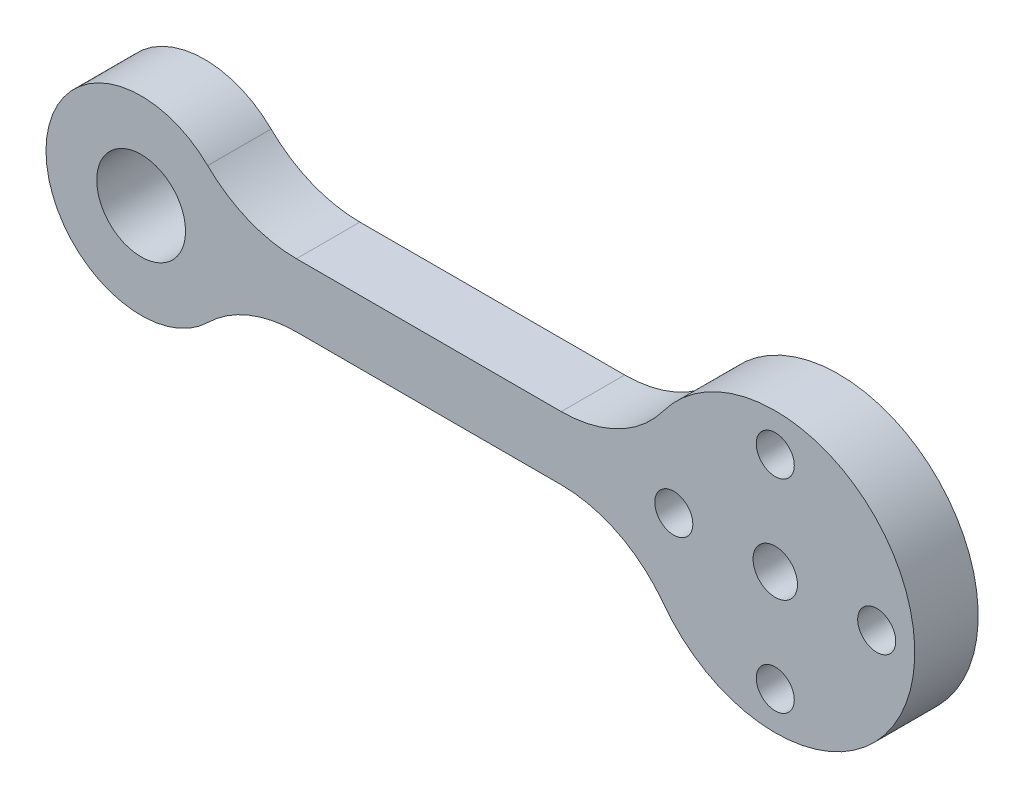
ISO-10303-21;
HEADER;
FILE_DESCRIPTION(('STEP AP214'),'2;1');
FILE_NAME('part.step','',(''),(''),'','','');
FILE_SCHEMA(('AUTOMOTIVE_DESIGN { 1 0 10303 214 1 1 1 1 }'));
ENDSEC;
DATA;
#1=APPLICATION_CONTEXT('core data for automotive mechanical design processes');
#2=APPLICATION_PROTOCOL_DEFINITION('international standard','automotive_design',2000,#1);
#3=PRODUCT_CONTEXT('',#1,'mechanical');
#4=PRODUCT('Part','Part','',(#3));
#5=PRODUCT_RELATED_PRODUCT_CATEGORY('part','',(#4));
#6=PRODUCT_DEFINITION_FORMATION('','',#4);
#7=PRODUCT_DEFINITION_CONTEXT('part definition',#1,'design');
#8=PRODUCT_DEFINITION('design','',#6,#7);
#9=PRODUCT_DEFINITION_SHAPE('','',#8);
#10=(LENGTH_UNIT() NAMED_UNIT(*) SI_UNIT(.MILLI.,.METRE.));
#11=(NAMED_UNIT(*) PLANE_ANGLE_UNIT() SI_UNIT($,.RADIAN.));
#12=(NAMED_UNIT(*) SI_UNIT($,.STERADIAN.) SOLID_ANGLE_UNIT());
#13=UNCERTAINTY_MEASURE_WITH_UNIT(LENGTH_MEASURE(1.E-05),#10,'distance_accuracy_value','');
#14=(GEOMETRIC_REPRESENTATION_CONTEXT(3) GLOBAL_UNCERTAINTY_ASSIGNED_CONTEXT((#13)) GLOBAL_UNIT_ASSIGNED_CONTEXT((#10,
#11,#12)) REPRESENTATION_CONTEXT('',''));
#15=CARTESIAN_POINT('',(0.,0.,0.));
#16=DIRECTION('',(0.,0.,1.));
#17=DIRECTION('',(1.,0.,0.));
#18=AXIS2_PLACEMENT_3D('',#15,#16,#17);
#19=CARTESIAN_POINT('',(0.,0.,-5.));
#20=DIRECTION('',(0.,0.,1.));
#21=DIRECTION('',(1.,0.,0.));
#22=AXIS2_PLACEMENT_3D('',#19,#20,#21);
#23=CYLINDRICAL_SURFACE('',#22,7.5);
#24=CARTESIAN_POINT('',(0.,0.,-5.));
#25=DIRECTION('',(0.,0.,1.));
#26=DIRECTION('',(1.,0.,0.));
#27=AXIS2_PLACEMENT_3D('',#24,#25,#26);
#28=CIRCLE('',#27,7.5);
#29=CARTESIAN_POINT('',(5.24890659167824,5.35714285714286,-5.));
#30=VERTEX_POINT('',#29);
#31=CARTESIAN_POINT('',(5.24890659167824,-5.35714285714286,-5.));
#32=VERTEX_POINT('',#31);
#33=EDGE_CURVE('E164',#30,#32,#28,.T.);
#34=ORIENTED_EDGE('',*,*,#33,.T.);
#35=DIRECTION('',(0.,0.,1.));
#36=VECTOR('',#35,1.);
#37=CARTESIAN_POINT('',(5.24890659167824,-5.35714285714286,-5.));
#38=LINE('',#37,#36);
#39=CARTESIAN_POINT('',(5.24890659167824,-5.35714285714286,0.));
#40=VERTEX_POINT('',#39);
#41=EDGE_CURVE('E146',#32,#40,#38,.T.);
#42=ORIENTED_EDGE('',*,*,#41,.T.);
#43=CARTESIAN_POINT('',(0.,0.,0.));
#44=DIRECTION('',(0.,0.,1.));
#45=DIRECTION('',(1.,0.,0.));
#46=AXIS2_PLACEMENT_3D('',#43,#44,#45);
#47=CIRCLE('',#46,7.5);
#48=CARTESIAN_POINT('',(5.24890659167824,5.35714285714286,0.));
#49=VERTEX_POINT('',#48);
#50=EDGE_CURVE('E108',#49,#40,#47,.T.);
#51=ORIENTED_EDGE('',*,*,#50,.F.);
#52=DIRECTION('',(0.,0.,1.));
#53=VECTOR('',#52,1.);
#54=CARTESIAN_POINT('',(5.24890659167824,5.35714285714286,-5.));
#55=LINE('',#54,#53);
#56=EDGE_CURVE('E59',#49,#30,#55,.F.);
#57=ORIENTED_EDGE('',*,*,#56,.T.);
#58=EDGE_LOOP('',(#34,#42,#51,#57));
#59=FACE_BOUND('',#58,.T.);
#60=ADVANCED_FACE('F37',(#59),#23,.T.);
#61=CARTESIAN_POINT('',(7.07106781186548,2.5,-5.));
#62=DIRECTION('',(0.,1.,0.));
#63=DIRECTION('',(-1.,0.,0.));
#64=AXIS2_PLACEMENT_3D('',#61,#62,#63);
#65=PLANE('',#64);
#66=DIRECTION('',(-1.,0.,0.));
#67=VECTOR('',#66,1.);
#68=CARTESIAN_POINT('',(7.07106781186548,2.5,0.));
#69=LINE('',#68,#67);
#70=CARTESIAN_POINT('',(33.1254629693138,2.5,0.));
#71=VERTEX_POINT('',#70);
#72=CARTESIAN_POINT('',(12.2474487139159,2.5,0.));
#73=VERTEX_POINT('',#72);
#74=EDGE_CURVE('E133',#71,#73,#69,.T.);
#75=ORIENTED_EDGE('',*,*,#74,.F.);
#76=DIRECTION('',(0.,0.,-1.));
#77=VECTOR('',#76,1.);
#78=CARTESIAN_POINT('',(33.1254629693138,2.5,-5.));
#79=LINE('',#78,#77);
#80=CARTESIAN_POINT('',(33.1254629693138,2.5,-5.));
#81=VERTEX_POINT('',#80);
#82=EDGE_CURVE('E143',#71,#81,#79,.T.);
#83=ORIENTED_EDGE('',*,*,#82,.T.);
#84=DIRECTION('',(-1.,0.,0.));
#85=VECTOR('',#84,1.);
#86=CARTESIAN_POINT('',(7.07106781186548,2.5,-5.));
#87=LINE('',#86,#85);
#88=CARTESIAN_POINT('',(12.2474487139159,2.5,-5.));
#89=VERTEX_POINT('',#88);
#90=EDGE_CURVE('E125',#81,#89,#87,.T.);
#91=ORIENTED_EDGE('',*,*,#90,.T.);
#92=DIRECTION('',(0.,0.,-1.));
#93=VECTOR('',#92,1.);
#94=CARTESIAN_POINT('',(12.2474487139159,2.5,0.));
#95=LINE('',#94,#93);
#96=EDGE_CURVE('E140',#89,#73,#95,.F.);
#97=ORIENTED_EDGE('',*,*,#96,.T.);
#98=EDGE_LOOP('',(#75,#83,#91,#97));
#99=FACE_BOUND('',#98,.T.);
#100=ADVANCED_FACE('F166',(#99),#65,.T.);
#101=CARTESIAN_POINT('',(50.,0.,-5.));
#102=DIRECTION('',(0.,0.,1.));
#103=DIRECTION('',(1.,0.,0.));
#104=AXIS2_PLACEMENT_3D('',#101,#102,#103);
#105=CYLINDRICAL_SURFACE('',#104,11.);
#106=CARTESIAN_POINT('',(50.,0.,0.));
#107=DIRECTION('',(0.,0.,1.));
#108=DIRECTION('',(1.,0.,0.));
#109=AXIS2_PLACEMENT_3D('',#106,#107,#108);
#110=CIRCLE('',#109,11.);
#111=CARTESIAN_POINT('',(41.1609567934501,-6.54761904761905,0.));
#112=VERTEX_POINT('',#111);
#113=CARTESIAN_POINT('',(41.1609567934501,6.54761904761905,0.));
#114=VERTEX_POINT('',#113);
#115=EDGE_CURVE('E122',#112,#114,#110,.T.);
#116=ORIENTED_EDGE('',*,*,#115,.F.);
#117=DIRECTION('',(0.,0.,1.));
#118=VECTOR('',#117,1.);
#119=CARTESIAN_POINT('',(41.1609567934501,-6.54761904761905,-5.));
#120=LINE('',#119,#118);
#121=CARTESIAN_POINT('',(41.1609567934501,-6.54761904761905,-5.));
#122=VERTEX_POINT('',#121);
#123=EDGE_CURVE('E138',#112,#122,#120,.F.);
#124=ORIENTED_EDGE('',*,*,#123,.T.);
#125=CARTESIAN_POINT('',(50.,0.,-5.));
#126=DIRECTION('',(0.,0.,1.));
#127=DIRECTION('',(1.,0.,0.));
#128=AXIS2_PLACEMENT_3D('',#125,#126,#127);
#129=CIRCLE('',#128,11.);
#130=CARTESIAN_POINT('',(41.1609567934501,6.54761904761905,-5.));
#131=VERTEX_POINT('',#130);
#132=EDGE_CURVE('E130',#122,#131,#129,.T.);
#133=ORIENTED_EDGE('',*,*,#132,.T.);
#134=DIRECTION('',(0.,0.,1.));
#135=VECTOR('',#134,1.);
#136=CARTESIAN_POINT('',(41.1609567934501,6.54761904761905,-5.));
#137=LINE('',#136,#135);
#138=EDGE_CURVE('E127',#131,#114,#137,.T.);
#139=ORIENTED_EDGE('',*,*,#138,.T.);
#140=EDGE_LOOP('',(#116,#124,#133,#139));
#141=FACE_BOUND('',#140,.T.);
#142=ADVANCED_FACE('F176',(#141),#105,.T.);
#143=CARTESIAN_POINT('',(7.07106781186548,-2.5,-5.));
#144=DIRECTION('',(0.,-1.,0.));
#145=DIRECTION('',(1.,0.,0.));
#146=AXIS2_PLACEMENT_3D('',#143,#144,#145);
#147=PLANE('',#146);
#148=DIRECTION('',(1.,0.,0.));
#149=VECTOR('',#148,1.);
#150=CARTESIAN_POINT('',(7.07106781186548,-2.5,-5.));
#151=LINE('',#150,#149);
#152=CARTESIAN_POINT('',(12.2474487139159,-2.5,-5.));
#153=VERTEX_POINT('',#152);
#154=CARTESIAN_POINT('',(33.1254629693138,-2.5,-5.));
#155=VERTEX_POINT('',#154);
#156=EDGE_CURVE('E179',#153,#155,#151,.T.);
#157=ORIENTED_EDGE('',*,*,#156,.T.);
#158=DIRECTION('',(0.,0.,-1.));
#159=VECTOR('',#158,1.);
#160=CARTESIAN_POINT('',(33.1254629693138,-2.5,0.));
#161=LINE('',#160,#159);
#162=CARTESIAN_POINT('',(33.1254629693138,-2.5,0.));
#163=VERTEX_POINT('',#162);
#164=EDGE_CURVE('E121',#155,#163,#161,.F.);
#165=ORIENTED_EDGE('',*,*,#164,.T.);
#166=DIRECTION('',(1.,0.,0.));
#167=VECTOR('',#166,1.);
#168=CARTESIAN_POINT('',(7.07106781186548,-2.5,0.));
#169=LINE('',#168,#167);
#170=CARTESIAN_POINT('',(12.2474487139159,-2.5,0.));
#171=VERTEX_POINT('',#170);
#172=EDGE_CURVE('E107',#171,#163,#169,.T.);
#173=ORIENTED_EDGE('',*,*,#172,.F.);
#174=DIRECTION('',(0.,0.,-1.));
#175=VECTOR('',#174,1.);
#176=CARTESIAN_POINT('',(12.2474487139159,-2.5,-5.));
#177=LINE('',#176,#175);
#178=EDGE_CURVE('E119',#171,#153,#177,.T.);
#179=ORIENTED_EDGE('',*,*,#178,.T.);
#180=EDGE_LOOP('',(#157,#165,#173,#179));
#181=FACE_BOUND('',#180,.T.);
#182=ADVANCED_FACE('F118',(#181),#147,.T.);
#183=CARTESIAN_POINT('',(0.,0.,-5.));
#184=DIRECTION('',(0.,0.,1.));
#185=DIRECTION('',(1.,0.,0.));
#186=AXIS2_PLACEMENT_3D('',#183,#184,#185);
#187=PLANE('',#186);
#188=CARTESIAN_POINT('',(42.,0.,-5.));
#189=DIRECTION('',(0.,0.,1.));
#190=DIRECTION('',(1.,0.,0.));
#191=AXIS2_PLACEMENT_3D('',#188,#189,#190);
#192=CIRCLE('',#191,1.5);
#193=CARTESIAN_POINT('',(43.5,0.,-5.));
#194=VERTEX_POINT('',#193);
#195=EDGE_CURVE('E211',#194,#194,#192,.T.);
#196=ORIENTED_EDGE('',*,*,#195,.T.);
#197=EDGE_LOOP('',(#196));
#198=FACE_BOUND('',#197,.T.);
#199=CARTESIAN_POINT('',(50.,-7.99999999999999,-5.));
#200=DIRECTION('',(0.,0.,1.));
#201=DIRECTION('',(1.,0.,0.));
#202=AXIS2_PLACEMENT_3D('',#199,#200,#201);
#203=CIRCLE('',#202,1.50000000000001);
#204=CARTESIAN_POINT('',(51.5,-7.99999999999999,-5.));
#205=VERTEX_POINT('',#204);
#206=EDGE_CURVE('E205',#205,#205,#203,.T.);
#207=ORIENTED_EDGE('',*,*,#206,.T.);
#208=EDGE_LOOP('',(#207));
#209=FACE_BOUND('',#208,.T.);
#210=CARTESIAN_POINT('',(50.,8.00000000000001,-5.));
#211=DIRECTION('',(0.,0.,1.));
#212=DIRECTION('',(1.,0.,0.));
#213=AXIS2_PLACEMENT_3D('',#210,#211,#212);
#214=CIRCLE('',#213,1.5);
#215=CARTESIAN_POINT('',(51.5,8.00000000000001,-5.));
#216=VERTEX_POINT('',#215);
#217=EDGE_CURVE('E199',#216,#216,#214,.T.);
#218=ORIENTED_EDGE('',*,*,#217,.T.);
#219=EDGE_LOOP('',(#218));
#220=FACE_BOUND('',#219,.T.);
#221=CARTESIAN_POINT('',(58.,0.,-5.));
#222=DIRECTION('',(0.,0.,1.));
#223=DIRECTION('',(1.,0.,0.));
#224=AXIS2_PLACEMENT_3D('',#221,#222,#223);
#225=CIRCLE('',#224,1.5);
#226=CARTESIAN_POINT('',(59.5,0.,-5.));
#227=VERTEX_POINT('',#226);
#228=EDGE_CURVE('E193',#227,#227,#225,.T.);
#229=ORIENTED_EDGE('',*,*,#228,.T.);
#230=EDGE_LOOP('',(#229));
#231=FACE_BOUND('',#230,.T.);
#232=CARTESIAN_POINT('',(50.,0.,-5.));
#233=DIRECTION('',(0.,0.,1.));
#234=DIRECTION('',(1.,0.,0.));
#235=AXIS2_PLACEMENT_3D('',#232,#233,#234);
#236=CIRCLE('',#235,1.75);
#237=CARTESIAN_POINT('',(51.75,0.,-5.));
#238=VERTEX_POINT('',#237);
#239=EDGE_CURVE('E187',#238,#238,#236,.T.);
#240=ORIENTED_EDGE('',*,*,#239,.T.);
#241=EDGE_LOOP('',(#240));
#242=FACE_BOUND('',#241,.T.);
#243=CARTESIAN_POINT('',(0.,0.,-5.));
#244=DIRECTION('',(0.,0.,1.));
#245=DIRECTION('',(1.,0.,0.));
#246=AXIS2_PLACEMENT_3D('',#243,#244,#245);
#247=CIRCLE('',#246,3.5);
#248=CARTESIAN_POINT('',(3.5,0.,-5.));
#249=VERTEX_POINT('',#248);
#250=EDGE_CURVE('E158',#249,#249,#247,.T.);
#251=ORIENTED_EDGE('',*,*,#250,.T.);
#252=EDGE_LOOP('',(#251));
#253=FACE_BOUND('',#252,.T.);
#254=ORIENTED_EDGE('',*,*,#33,.F.);
#255=CARTESIAN_POINT('',(12.2474487139159,12.5,-5.));
#256=DIRECTION('',(0.,0.,1.));
#257=DIRECTION('',(1.,0.,0.));
#258=AXIS2_PLACEMENT_3D('',#255,#256,#257);
#259=CIRCLE('',#258,10.);
#260=EDGE_CURVE('E11',#30,#89,#259,.T.);
#261=ORIENTED_EDGE('',*,*,#260,.T.);
#262=ORIENTED_EDGE('',*,*,#90,.F.);
#263=CARTESIAN_POINT('',(33.1254629693138,12.5,-5.));
#264=DIRECTION('',(0.,0.,1.));
#265=DIRECTION('',(1.,0.,0.));
#266=AXIS2_PLACEMENT_3D('',#263,#264,#265);
#267=CIRCLE('',#266,10.);
#268=EDGE_CURVE('E113',#81,#131,#267,.T.);
#269=ORIENTED_EDGE('',*,*,#268,.T.);
#270=ORIENTED_EDGE('',*,*,#132,.F.);
#271=CARTESIAN_POINT('',(33.1254629693138,-12.5,-5.));
#272=DIRECTION('',(0.,0.,1.));
#273=DIRECTION('',(1.,0.,0.));
#274=AXIS2_PLACEMENT_3D('',#271,#272,#273);
#275=CIRCLE('',#274,10.);
#276=EDGE_CURVE('E150',#122,#155,#275,.T.);
#277=ORIENTED_EDGE('',*,*,#276,.T.);
#278=ORIENTED_EDGE('',*,*,#156,.F.);
#279=CARTESIAN_POINT('',(12.2474487139159,-12.5,-5.));
#280=DIRECTION('',(0.,0.,1.));
#281=DIRECTION('',(1.,0.,0.));
#282=AXIS2_PLACEMENT_3D('',#279,#280,#281);
#283=CIRCLE('',#282,10.);
#284=EDGE_CURVE('E52',#153,#32,#283,.T.);
#285=ORIENTED_EDGE('',*,*,#284,.T.);
#286=EDGE_LOOP('',(#254,#261,#262,#269,#270,#277,#278,#285));
#287=FACE_BOUND('',#286,.T.);
#288=ADVANCED_FACE('F162',(#198,#209,#220,#231,#242,#253,#287),#187,.F.);
#289=CARTESIAN_POINT('',(0.,0.,0.));
#290=DIRECTION('',(0.,0.,1.));
#291=DIRECTION('',(1.,0.,0.));
#292=AXIS2_PLACEMENT_3D('',#289,#290,#291);
#293=PLANE('',#292);
#294=CARTESIAN_POINT('',(42.,0.,0.));
#295=DIRECTION('',(0.,0.,1.));
#296=DIRECTION('',(1.,0.,0.));
#297=AXIS2_PLACEMENT_3D('',#294,#295,#296);
#298=CIRCLE('',#297,1.5);
#299=CARTESIAN_POINT('',(43.5,0.,0.));
#300=VERTEX_POINT('',#299);
#301=EDGE_CURVE('E214',#300,#300,#298,.T.);
#302=ORIENTED_EDGE('',*,*,#301,.F.);
#303=EDGE_LOOP('',(#302));
#304=FACE_BOUND('',#303,.T.);
#305=CARTESIAN_POINT('',(50.,-7.99999999999999,0.));
#306=DIRECTION('',(0.,0.,1.));
#307=DIRECTION('',(1.,0.,0.));
#308=AXIS2_PLACEMENT_3D('',#305,#306,#307);
#309=CIRCLE('',#308,1.50000000000001);
#310=CARTESIAN_POINT('',(51.5,-7.99999999999999,0.));
#311=VERTEX_POINT('',#310);
#312=EDGE_CURVE('E208',#311,#311,#309,.T.);
#313=ORIENTED_EDGE('',*,*,#312,.F.);
#314=EDGE_LOOP('',(#313));
#315=FACE_BOUND('',#314,.T.);
#316=CARTESIAN_POINT('',(50.,8.00000000000001,0.));
#317=DIRECTION('',(0.,0.,1.));
#318=DIRECTION('',(1.,0.,0.));
#319=AXIS2_PLACEMENT_3D('',#316,#317,#318);
#320=CIRCLE('',#319,1.5);
#321=CARTESIAN_POINT('',(51.5,8.00000000000001,0.));
#322=VERTEX_POINT('',#321);
#323=EDGE_CURVE('E202',#322,#322,#320,.T.);
#324=ORIENTED_EDGE('',*,*,#323,.F.);
#325=EDGE_LOOP('',(#324));
#326=FACE_BOUND('',#325,.T.);
#327=CARTESIAN_POINT('',(58.,0.,0.));
#328=DIRECTION('',(0.,0.,1.));
#329=DIRECTION('',(1.,0.,0.));
#330=AXIS2_PLACEMENT_3D('',#327,#328,#329);
#331=CIRCLE('',#330,1.5);
#332=CARTESIAN_POINT('',(59.5,0.,0.));
#333=VERTEX_POINT('',#332);
#334=EDGE_CURVE('E196',#333,#333,#331,.T.);
#335=ORIENTED_EDGE('',*,*,#334,.F.);
#336=EDGE_LOOP('',(#335));
#337=FACE_BOUND('',#336,.T.);
#338=CARTESIAN_POINT('',(50.,0.,0.));
#339=DIRECTION('',(0.,0.,1.));
#340=DIRECTION('',(1.,0.,0.));
#341=AXIS2_PLACEMENT_3D('',#338,#339,#340);
#342=CIRCLE('',#341,1.75);
#343=CARTESIAN_POINT('',(51.75,0.,0.));
#344=VERTEX_POINT('',#343);
#345=EDGE_CURVE('E190',#344,#344,#342,.T.);
#346=ORIENTED_EDGE('',*,*,#345,.F.);
#347=EDGE_LOOP('',(#346));
#348=FACE_BOUND('',#347,.T.);
#349=CARTESIAN_POINT('',(0.,0.,0.));
#350=DIRECTION('',(0.,0.,1.));
#351=DIRECTION('',(1.,0.,0.));
#352=AXIS2_PLACEMENT_3D('',#349,#350,#351);
#353=CIRCLE('',#352,3.5);
#354=CARTESIAN_POINT('',(3.5,0.,0.));
#355=VERTEX_POINT('',#354);
#356=EDGE_CURVE('E184',#355,#355,#353,.T.);
#357=ORIENTED_EDGE('',*,*,#356,.F.);
#358=EDGE_LOOP('',(#357));
#359=FACE_BOUND('',#358,.T.);
#360=ORIENTED_EDGE('',*,*,#74,.T.);
#361=CARTESIAN_POINT('',(12.2474487139159,12.5,0.));
#362=DIRECTION('',(0.,0.,1.));
#363=DIRECTION('',(1.,0.,0.));
#364=AXIS2_PLACEMENT_3D('',#361,#362,#363);
#365=CIRCLE('',#364,10.);
#366=EDGE_CURVE('E45',#73,#49,#365,.F.);
#367=ORIENTED_EDGE('',*,*,#366,.T.);
#368=ORIENTED_EDGE('',*,*,#50,.T.);
#369=CARTESIAN_POINT('',(12.2474487139159,-12.5,0.));
#370=DIRECTION('',(0.,0.,1.));
#371=DIRECTION('',(1.,0.,0.));
#372=AXIS2_PLACEMENT_3D('',#369,#370,#371);
#373=CIRCLE('',#372,10.);
#374=EDGE_CURVE('E103',#40,#171,#373,.F.);
#375=ORIENTED_EDGE('',*,*,#374,.T.);
#376=ORIENTED_EDGE('',*,*,#172,.T.);
#377=CARTESIAN_POINT('',(33.1254629693138,-12.5,0.));
#378=DIRECTION('',(0.,0.,1.));
#379=DIRECTION('',(1.,0.,0.));
#380=AXIS2_PLACEMENT_3D('',#377,#378,#379);
#381=CIRCLE('',#380,10.);
#382=EDGE_CURVE('E148',#163,#112,#381,.F.);
#383=ORIENTED_EDGE('',*,*,#382,.T.);
#384=ORIENTED_EDGE('',*,*,#115,.T.);
#385=CARTESIAN_POINT('',(33.1254629693138,12.5,0.));
#386=DIRECTION('',(0.,0.,1.));
#387=DIRECTION('',(1.,0.,0.));
#388=AXIS2_PLACEMENT_3D('',#385,#386,#387);
#389=CIRCLE('',#388,10.);
#390=EDGE_CURVE('E152',#114,#71,#389,.F.);
#391=ORIENTED_EDGE('',*,*,#390,.T.);
#392=EDGE_LOOP('',(#360,#367,#368,#375,#376,#383,#384,#391));
#393=FACE_BOUND('',#392,.T.);
#394=ADVANCED_FACE('F106',(#304,#315,#326,#337,#348,#359,#393),#293,.T.);
#395=CARTESIAN_POINT('',(0.,0.,-5.));
#396=DIRECTION('',(0.,0.,1.));
#397=DIRECTION('',(1.,0.,0.));
#398=AXIS2_PLACEMENT_3D('',#395,#396,#397);
#399=CYLINDRICAL_SURFACE('',#398,3.5);
#400=ORIENTED_EDGE('',*,*,#250,.F.);
#401=EDGE_LOOP('',(#400));
#402=FACE_BOUND('',#401,.T.);
#403=ORIENTED_EDGE('',*,*,#356,.T.);
#404=EDGE_LOOP('',(#403));
#405=FACE_BOUND('',#404,.T.);
#406=ADVANCED_FACE('F232',(#402,#405),#399,.F.);
#407=CARTESIAN_POINT('',(50.,0.,-5.));
#408=DIRECTION('',(0.,0.,1.));
#409=DIRECTION('',(1.,0.,0.));
#410=AXIS2_PLACEMENT_3D('',#407,#408,#409);
#411=CYLINDRICAL_SURFACE('',#410,1.75);
#412=ORIENTED_EDGE('',*,*,#239,.F.);
#413=EDGE_LOOP('',(#412));
#414=FACE_BOUND('',#413,.T.);
#415=ORIENTED_EDGE('',*,*,#345,.T.);
#416=EDGE_LOOP('',(#415));
#417=FACE_BOUND('',#416,.T.);
#418=ADVANCED_FACE('F245',(#414,#417),#411,.F.);
#419=CARTESIAN_POINT('',(58.,0.,-5.));
#420=DIRECTION('',(0.,0.,1.));
#421=DIRECTION('',(1.,0.,0.));
#422=AXIS2_PLACEMENT_3D('',#419,#420,#421);
#423=CYLINDRICAL_SURFACE('',#422,1.5);
#424=ORIENTED_EDGE('',*,*,#228,.F.);
#425=EDGE_LOOP('',(#424));
#426=FACE_BOUND('',#425,.T.);
#427=ORIENTED_EDGE('',*,*,#334,.T.);
#428=EDGE_LOOP('',(#427));
#429=FACE_BOUND('',#428,.T.);
#430=ADVANCED_FACE('F251',(#426,#429),#423,.F.);
#431=CARTESIAN_POINT('',(50.,8.00000000000001,-5.));
#432=DIRECTION('',(0.,0.,1.));
#433=DIRECTION('',(1.,0.,0.));
#434=AXIS2_PLACEMENT_3D('',#431,#432,#433);
#435=CYLINDRICAL_SURFACE('',#434,1.5);
#436=ORIENTED_EDGE('',*,*,#217,.F.);
#437=EDGE_LOOP('',(#436));
#438=FACE_BOUND('',#437,.T.);
#439=ORIENTED_EDGE('',*,*,#323,.T.);
#440=EDGE_LOOP('',(#439));
#441=FACE_BOUND('',#440,.T.);
#442=ADVANCED_FACE('F351',(#438,#441),#435,.F.);
#443=CARTESIAN_POINT('',(50.,-7.99999999999999,-5.));
#444=DIRECTION('',(0.,0.,1.));
#445=DIRECTION('',(1.,0.,0.));
#446=AXIS2_PLACEMENT_3D('',#443,#444,#445);
#447=CYLINDRICAL_SURFACE('',#446,1.50000000000001);
#448=ORIENTED_EDGE('',*,*,#206,.F.);
#449=EDGE_LOOP('',(#448));
#450=FACE_BOUND('',#449,.T.);
#451=ORIENTED_EDGE('',*,*,#312,.T.);
#452=EDGE_LOOP('',(#451));
#453=FACE_BOUND('',#452,.T.);
#454=ADVANCED_FACE('F226',(#450,#453),#447,.F.);
#455=CARTESIAN_POINT('',(42.,0.,-5.));
#456=DIRECTION('',(0.,0.,1.));
#457=DIRECTION('',(1.,0.,0.));
#458=AXIS2_PLACEMENT_3D('',#455,#456,#457);
#459=CYLINDRICAL_SURFACE('',#458,1.5);
#460=ORIENTED_EDGE('',*,*,#195,.F.);
#461=EDGE_LOOP('',(#460));
#462=FACE_BOUND('',#461,.T.);
#463=ORIENTED_EDGE('',*,*,#301,.T.);
#464=EDGE_LOOP('',(#463));
#465=FACE_BOUND('',#464,.T.);
#466=ADVANCED_FACE('F222',(#462,#465),#459,.F.);
#467=CARTESIAN_POINT('',(33.1254629693138,-12.5,-5.));
#468=DIRECTION('',(0.,0.,1.));
#469=DIRECTION('',(1.,0.,0.));
#470=AXIS2_PLACEMENT_3D('',#467,#468,#469);
#471=CYLINDRICAL_SURFACE('',#470,10.);
#472=ORIENTED_EDGE('',*,*,#276,.F.);
#473=ORIENTED_EDGE('',*,*,#123,.F.);
#474=ORIENTED_EDGE('',*,*,#382,.F.);
#475=ORIENTED_EDGE('',*,*,#164,.F.);
#476=EDGE_LOOP('',(#472,#473,#474,#475));
#477=FACE_BOUND('',#476,.T.);
#478=ADVANCED_FACE('F225',(#477),#471,.F.);
#479=CARTESIAN_POINT('',(33.1254629693138,12.5,-5.));
#480=DIRECTION('',(0.,0.,1.));
#481=DIRECTION('',(1.,0.,0.));
#482=AXIS2_PLACEMENT_3D('',#479,#480,#481);
#483=CYLINDRICAL_SURFACE('',#482,10.);
#484=ORIENTED_EDGE('',*,*,#268,.F.);
#485=ORIENTED_EDGE('',*,*,#82,.F.);
#486=ORIENTED_EDGE('',*,*,#390,.F.);
#487=ORIENTED_EDGE('',*,*,#138,.F.);
#488=EDGE_LOOP('',(#484,#485,#486,#487));
#489=FACE_BOUND('',#488,.T.);
#490=ADVANCED_FACE('F169',(#489),#483,.F.);
#491=CARTESIAN_POINT('',(12.2474487139159,-12.5,-5.));
#492=DIRECTION('',(0.,0.,1.));
#493=DIRECTION('',(1.,0.,0.));
#494=AXIS2_PLACEMENT_3D('',#491,#492,#493);
#495=CYLINDRICAL_SURFACE('',#494,10.);
#496=ORIENTED_EDGE('',*,*,#284,.F.);
#497=ORIENTED_EDGE('',*,*,#178,.F.);
#498=ORIENTED_EDGE('',*,*,#374,.F.);
#499=ORIENTED_EDGE('',*,*,#41,.F.);
#500=EDGE_LOOP('',(#496,#497,#498,#499));
#501=FACE_BOUND('',#500,.T.);
#502=ADVANCED_FACE('F124',(#501),#495,.F.);
#503=CARTESIAN_POINT('',(12.2474487139159,12.5,-5.));
#504=DIRECTION('',(0.,0.,1.));
#505=DIRECTION('',(1.,0.,0.));
#506=AXIS2_PLACEMENT_3D('',#503,#504,#505);
#507=CYLINDRICAL_SURFACE('',#506,10.);
#508=ORIENTED_EDGE('',*,*,#260,.F.);
#509=ORIENTED_EDGE('',*,*,#56,.F.);
#510=ORIENTED_EDGE('',*,*,#366,.F.);
#511=ORIENTED_EDGE('',*,*,#96,.F.);
#512=EDGE_LOOP('',(#508,#509,#510,#511));
#513=FACE_BOUND('',#512,.T.);
#514=ADVANCED_FACE('F39',(#513),#507,.F.);
#515=CLOSED_SHELL('',(#60,#100,#142,#182,#288,#394,#406,#418,#430,#442,#454,#466,#478,#490,#502,#514));
#516=MANIFOLD_SOLID_BREP('B2',#515);
#517=ADVANCED_BREP_SHAPE_REPRESENTATION('',(#18,#516),#14);
#518=SHAPE_DEFINITION_REPRESENTATION(#9,#517);
ENDSEC;
END-ISO-10303-21;
